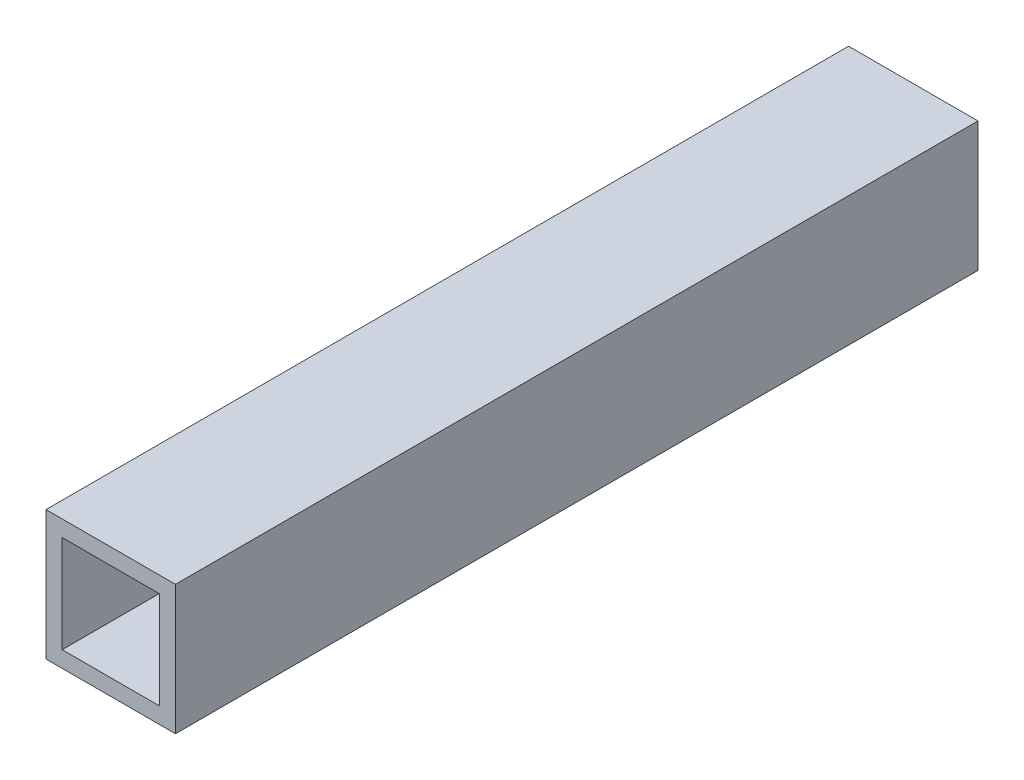
ISO-10303-21;
HEADER;
FILE_DESCRIPTION(('STEP AP214'),'2;1');
FILE_NAME('part.step','',(''),(''),'','','');
FILE_SCHEMA(('AUTOMOTIVE_DESIGN { 1 0 10303 214 1 1 1 1 }'));
ENDSEC;
DATA;
#1=APPLICATION_CONTEXT('core data for automotive mechanical design processes');
#2=APPLICATION_PROTOCOL_DEFINITION('international standard','automotive_design',2000,#1);
#3=PRODUCT_CONTEXT('',#1,'mechanical');
#4=PRODUCT('Part','Part','',(#3));
#5=PRODUCT_RELATED_PRODUCT_CATEGORY('part','',(#4));
#6=PRODUCT_DEFINITION_FORMATION('','',#4);
#7=PRODUCT_DEFINITION_CONTEXT('part definition',#1,'design');
#8=PRODUCT_DEFINITION('design','',#6,#7);
#9=PRODUCT_DEFINITION_SHAPE('','',#8);
#10=(LENGTH_UNIT() NAMED_UNIT(*) SI_UNIT(.MILLI.,.METRE.));
#11=(NAMED_UNIT(*) PLANE_ANGLE_UNIT() SI_UNIT($,.RADIAN.));
#12=(NAMED_UNIT(*) SI_UNIT($,.STERADIAN.) SOLID_ANGLE_UNIT());
#13=UNCERTAINTY_MEASURE_WITH_UNIT(LENGTH_MEASURE(1.E-05),#10,'distance_accuracy_value','');
#14=(GEOMETRIC_REPRESENTATION_CONTEXT(3) GLOBAL_UNCERTAINTY_ASSIGNED_CONTEXT((#13)) GLOBAL_UNIT_ASSIGNED_CONTEXT((#10,
#11,#12)) REPRESENTATION_CONTEXT('',''));
#15=CARTESIAN_POINT('',(0.,0.,0.));
#16=DIRECTION('',(0.,0.,1.));
#17=DIRECTION('',(1.,0.,0.));
#18=AXIS2_PLACEMENT_3D('',#15,#16,#17);
#19=CARTESIAN_POINT('',(0.,0.,78.74));
#20=DIRECTION('',(0.,0.,1.));
#21=DIRECTION('',(1.,0.,0.));
#22=AXIS2_PLACEMENT_3D('',#19,#20,#21);
#23=PLANE('',#22);
#24=DIRECTION('',(0.,-1.,0.));
#25=VECTOR('',#24,1.);
#26=CARTESIAN_POINT('',(-12.7,-12.7,78.74));
#27=LINE('',#26,#25);
#28=CARTESIAN_POINT('',(-12.7,12.7,78.74));
#29=VERTEX_POINT('',#28);
#30=CARTESIAN_POINT('',(-12.7,-12.7,78.74));
#31=VERTEX_POINT('',#30);
#32=EDGE_CURVE('E117',#29,#31,#27,.T.);
#33=ORIENTED_EDGE('',*,*,#32,.T.);
#34=DIRECTION('',(1.,0.,0.));
#35=VECTOR('',#34,1.);
#36=CARTESIAN_POINT('',(12.7,-12.7,78.74));
#37=LINE('',#36,#35);
#38=CARTESIAN_POINT('',(12.7,-12.7,78.74));
#39=VERTEX_POINT('',#38);
#40=EDGE_CURVE('E176',#31,#39,#37,.T.);
#41=ORIENTED_EDGE('',*,*,#40,.T.);
#42=DIRECTION('',(0.,1.,0.));
#43=VECTOR('',#42,1.);
#44=CARTESIAN_POINT('',(12.7,-12.7,78.74));
#45=LINE('',#44,#43);
#46=CARTESIAN_POINT('',(12.7,12.7,78.74));
#47=VERTEX_POINT('',#46);
#48=EDGE_CURVE('E179',#39,#47,#45,.T.);
#49=ORIENTED_EDGE('',*,*,#48,.T.);
#50=DIRECTION('',(-1.,0.,0.));
#51=VECTOR('',#50,1.);
#52=CARTESIAN_POINT('',(12.7,12.7,78.74));
#53=LINE('',#52,#51);
#54=EDGE_CURVE('E63',#47,#29,#53,.T.);
#55=ORIENTED_EDGE('',*,*,#54,.T.);
#56=EDGE_LOOP('',(#33,#41,#49,#55));
#57=FACE_BOUND('',#56,.T.);
#58=DIRECTION('',(1.,0.,0.));
#59=VECTOR('',#58,1.);
#60=CARTESIAN_POINT('',(9.525,-9.525,78.74));
#61=LINE('',#60,#59);
#62=CARTESIAN_POINT('',(-9.52499999999999,-9.525,78.74));
#63=VERTEX_POINT('',#62);
#64=CARTESIAN_POINT('',(9.525,-9.525,78.74));
#65=VERTEX_POINT('',#64);
#66=EDGE_CURVE('E158',#63,#65,#61,.T.);
#67=ORIENTED_EDGE('',*,*,#66,.F.);
#68=DIRECTION('',(0.,-1.,0.));
#69=VECTOR('',#68,1.);
#70=CARTESIAN_POINT('',(-9.52499999999999,-9.525,78.74));
#71=LINE('',#70,#69);
#72=CARTESIAN_POINT('',(-9.52499999999999,9.525,78.74));
#73=VERTEX_POINT('',#72);
#74=EDGE_CURVE('E113',#73,#63,#71,.T.);
#75=ORIENTED_EDGE('',*,*,#74,.F.);
#76=DIRECTION('',(-1.,0.,0.));
#77=VECTOR('',#76,1.);
#78=CARTESIAN_POINT('',(9.525,9.525,78.74));
#79=LINE('',#78,#77);
#80=CARTESIAN_POINT('',(9.525,9.525,78.74));
#81=VERTEX_POINT('',#80);
#82=EDGE_CURVE('E164',#81,#73,#79,.T.);
#83=ORIENTED_EDGE('',*,*,#82,.F.);
#84=DIRECTION('',(0.,1.,0.));
#85=VECTOR('',#84,1.);
#86=CARTESIAN_POINT('',(9.525,-9.525,78.74));
#87=LINE('',#86,#85);
#88=EDGE_CURVE('E161',#65,#81,#87,.T.);
#89=ORIENTED_EDGE('',*,*,#88,.F.);
#90=EDGE_LOOP('',(#67,#75,#83,#89));
#91=FACE_BOUND('',#90,.T.);
#92=ADVANCED_FACE('F39',(#57,#91),#23,.T.);
#93=CARTESIAN_POINT('',(-12.7,-12.7,78.74));
#94=DIRECTION('',(1.,0.,0.));
#95=DIRECTION('',(0.,0.,-1.));
#96=AXIS2_PLACEMENT_3D('',#93,#94,#95);
#97=PLANE('',#96);
#98=DIRECTION('',(0.,0.,-1.));
#99=VECTOR('',#98,1.);
#100=CARTESIAN_POINT('',(-12.7,12.7,78.74));
#101=LINE('',#100,#99);
#102=CARTESIAN_POINT('',(-12.7,12.7,-78.74));
#103=VERTEX_POINT('',#102);
#104=EDGE_CURVE('E184',#29,#103,#101,.T.);
#105=ORIENTED_EDGE('',*,*,#104,.T.);
#106=DIRECTION('',(0.,-1.,0.));
#107=VECTOR('',#106,1.);
#108=CARTESIAN_POINT('',(-12.7,-12.7,-78.74));
#109=LINE('',#108,#107);
#110=CARTESIAN_POINT('',(-12.7,-12.7,-78.74));
#111=VERTEX_POINT('',#110);
#112=EDGE_CURVE('E140',#103,#111,#109,.T.);
#113=ORIENTED_EDGE('',*,*,#112,.T.);
#114=DIRECTION('',(0.,0.,-1.));
#115=VECTOR('',#114,1.);
#116=CARTESIAN_POINT('',(-12.7,-12.7,78.74));
#117=LINE('',#116,#115);
#118=EDGE_CURVE('E11',#31,#111,#117,.T.);
#119=ORIENTED_EDGE('',*,*,#118,.F.);
#120=ORIENTED_EDGE('',*,*,#32,.F.);
#121=EDGE_LOOP('',(#105,#113,#119,#120));
#122=FACE_BOUND('',#121,.T.);
#123=ADVANCED_FACE('F41',(#122),#97,.F.);
#124=CARTESIAN_POINT('',(12.7,-12.7,78.74));
#125=DIRECTION('',(0.,1.,0.));
#126=DIRECTION('',(0.,0.,1.));
#127=AXIS2_PLACEMENT_3D('',#124,#125,#126);
#128=PLANE('',#127);
#129=ORIENTED_EDGE('',*,*,#118,.T.);
#130=DIRECTION('',(1.,0.,0.));
#131=VECTOR('',#130,1.);
#132=CARTESIAN_POINT('',(12.7,-12.7,-78.74));
#133=LINE('',#132,#131);
#134=CARTESIAN_POINT('',(12.7,-12.7,-78.74));
#135=VERTEX_POINT('',#134);
#136=EDGE_CURVE('E144',#111,#135,#133,.T.);
#137=ORIENTED_EDGE('',*,*,#136,.T.);
#138=DIRECTION('',(0.,0.,-1.));
#139=VECTOR('',#138,1.);
#140=CARTESIAN_POINT('',(12.7,-12.7,78.74));
#141=LINE('',#140,#139);
#142=EDGE_CURVE('E48',#39,#135,#141,.T.);
#143=ORIENTED_EDGE('',*,*,#142,.F.);
#144=ORIENTED_EDGE('',*,*,#40,.F.);
#145=EDGE_LOOP('',(#129,#137,#143,#144));
#146=FACE_BOUND('',#145,.T.);
#147=ADVANCED_FACE('F200',(#146),#128,.F.);
#148=CARTESIAN_POINT('',(12.7,-12.7,78.74));
#149=DIRECTION('',(-1.,0.,0.));
#150=DIRECTION('',(0.,0.,1.));
#151=AXIS2_PLACEMENT_3D('',#148,#149,#150);
#152=PLANE('',#151);
#153=ORIENTED_EDGE('',*,*,#142,.T.);
#154=DIRECTION('',(0.,1.,0.));
#155=VECTOR('',#154,1.);
#156=CARTESIAN_POINT('',(12.7,-12.7,-78.74));
#157=LINE('',#156,#155);
#158=CARTESIAN_POINT('',(12.7,12.7,-78.74));
#159=VERTEX_POINT('',#158);
#160=EDGE_CURVE('E148',#135,#159,#157,.T.);
#161=ORIENTED_EDGE('',*,*,#160,.T.);
#162=DIRECTION('',(0.,0.,-1.));
#163=VECTOR('',#162,1.);
#164=CARTESIAN_POINT('',(12.7,12.7,78.74));
#165=LINE('',#164,#163);
#166=EDGE_CURVE('E187',#47,#159,#165,.T.);
#167=ORIENTED_EDGE('',*,*,#166,.F.);
#168=ORIENTED_EDGE('',*,*,#48,.F.);
#169=EDGE_LOOP('',(#153,#161,#167,#168));
#170=FACE_BOUND('',#169,.T.);
#171=ADVANCED_FACE('F194',(#170),#152,.F.);
#172=CARTESIAN_POINT('',(12.7,12.7,78.74));
#173=DIRECTION('',(0.,-1.,0.));
#174=DIRECTION('',(0.,0.,-1.));
#175=AXIS2_PLACEMENT_3D('',#172,#173,#174);
#176=PLANE('',#175);
#177=ORIENTED_EDGE('',*,*,#166,.T.);
#178=DIRECTION('',(-1.,0.,0.));
#179=VECTOR('',#178,1.);
#180=CARTESIAN_POINT('',(12.7,12.7,-78.74));
#181=LINE('',#180,#179);
#182=EDGE_CURVE('E152',#159,#103,#181,.T.);
#183=ORIENTED_EDGE('',*,*,#182,.T.);
#184=ORIENTED_EDGE('',*,*,#104,.F.);
#185=ORIENTED_EDGE('',*,*,#54,.F.);
#186=EDGE_LOOP('',(#177,#183,#184,#185));
#187=FACE_BOUND('',#186,.T.);
#188=ADVANCED_FACE('F205',(#187),#176,.F.);
#189=CARTESIAN_POINT('',(-9.52499999999999,-9.525,78.74));
#190=DIRECTION('',(1.,0.,0.));
#191=DIRECTION('',(0.,0.,-1.));
#192=AXIS2_PLACEMENT_3D('',#189,#190,#191);
#193=PLANE('',#192);
#194=DIRECTION('',(0.,0.,-1.));
#195=VECTOR('',#194,1.);
#196=CARTESIAN_POINT('',(-9.52499999999999,-9.525,78.74));
#197=LINE('',#196,#195);
#198=CARTESIAN_POINT('',(-9.52499999999999,-9.525,-78.74));
#199=VERTEX_POINT('',#198);
#200=EDGE_CURVE('E105',#63,#199,#197,.T.);
#201=ORIENTED_EDGE('',*,*,#200,.T.);
#202=DIRECTION('',(0.,-1.,0.));
#203=VECTOR('',#202,1.);
#204=CARTESIAN_POINT('',(-9.52499999999999,-9.525,-78.74));
#205=LINE('',#204,#203);
#206=CARTESIAN_POINT('',(-9.52499999999999,9.525,-78.74));
#207=VERTEX_POINT('',#206);
#208=EDGE_CURVE('E110',#207,#199,#205,.T.);
#209=ORIENTED_EDGE('',*,*,#208,.F.);
#210=DIRECTION('',(0.,0.,-1.));
#211=VECTOR('',#210,1.);
#212=CARTESIAN_POINT('',(-9.52499999999999,9.525,78.74));
#213=LINE('',#212,#211);
#214=EDGE_CURVE('E167',#73,#207,#213,.T.);
#215=ORIENTED_EDGE('',*,*,#214,.F.);
#216=ORIENTED_EDGE('',*,*,#74,.T.);
#217=EDGE_LOOP('',(#201,#209,#215,#216));
#218=FACE_BOUND('',#217,.T.);
#219=ADVANCED_FACE('F107',(#218),#193,.T.);
#220=CARTESIAN_POINT('',(9.525,-9.525,78.74));
#221=DIRECTION('',(0.,1.,0.));
#222=DIRECTION('',(0.,0.,1.));
#223=AXIS2_PLACEMENT_3D('',#220,#221,#222);
#224=PLANE('',#223);
#225=DIRECTION('',(0.,0.,-1.));
#226=VECTOR('',#225,1.);
#227=CARTESIAN_POINT('',(9.525,-9.525,78.74));
#228=LINE('',#227,#226);
#229=CARTESIAN_POINT('',(9.525,-9.525,-78.74));
#230=VERTEX_POINT('',#229);
#231=EDGE_CURVE('E118',#65,#230,#228,.T.);
#232=ORIENTED_EDGE('',*,*,#231,.T.);
#233=DIRECTION('',(1.,0.,0.));
#234=VECTOR('',#233,1.);
#235=CARTESIAN_POINT('',(9.525,-9.525,-78.74));
#236=LINE('',#235,#234);
#237=EDGE_CURVE('E121',#199,#230,#236,.T.);
#238=ORIENTED_EDGE('',*,*,#237,.F.);
#239=ORIENTED_EDGE('',*,*,#200,.F.);
#240=ORIENTED_EDGE('',*,*,#66,.T.);
#241=EDGE_LOOP('',(#232,#238,#239,#240));
#242=FACE_BOUND('',#241,.T.);
#243=ADVANCED_FACE('F122',(#242),#224,.T.);
#244=CARTESIAN_POINT('',(9.525,-9.525,78.74));
#245=DIRECTION('',(-1.,0.,0.));
#246=DIRECTION('',(0.,0.,1.));
#247=AXIS2_PLACEMENT_3D('',#244,#245,#246);
#248=PLANE('',#247);
#249=DIRECTION('',(0.,0.,-1.));
#250=VECTOR('',#249,1.);
#251=CARTESIAN_POINT('',(9.525,9.525,78.74));
#252=LINE('',#251,#250);
#253=CARTESIAN_POINT('',(9.525,9.525,-78.74));
#254=VERTEX_POINT('',#253);
#255=EDGE_CURVE('E55',#81,#254,#252,.T.);
#256=ORIENTED_EDGE('',*,*,#255,.T.);
#257=DIRECTION('',(0.,1.,0.));
#258=VECTOR('',#257,1.);
#259=CARTESIAN_POINT('',(9.525,-9.525,-78.74));
#260=LINE('',#259,#258);
#261=EDGE_CURVE('E128',#230,#254,#260,.T.);
#262=ORIENTED_EDGE('',*,*,#261,.F.);
#263=ORIENTED_EDGE('',*,*,#231,.F.);
#264=ORIENTED_EDGE('',*,*,#88,.T.);
#265=EDGE_LOOP('',(#256,#262,#263,#264));
#266=FACE_BOUND('',#265,.T.);
#267=ADVANCED_FACE('F223',(#266),#248,.T.);
#268=CARTESIAN_POINT('',(9.525,9.525,78.74));
#269=DIRECTION('',(0.,-1.,0.));
#270=DIRECTION('',(0.,0.,-1.));
#271=AXIS2_PLACEMENT_3D('',#268,#269,#270);
#272=PLANE('',#271);
#273=ORIENTED_EDGE('',*,*,#214,.T.);
#274=DIRECTION('',(-1.,0.,0.));
#275=VECTOR('',#274,1.);
#276=CARTESIAN_POINT('',(9.525,9.525,-78.74));
#277=LINE('',#276,#275);
#278=EDGE_CURVE('E132',#254,#207,#277,.T.);
#279=ORIENTED_EDGE('',*,*,#278,.F.);
#280=ORIENTED_EDGE('',*,*,#255,.F.);
#281=ORIENTED_EDGE('',*,*,#82,.T.);
#282=EDGE_LOOP('',(#273,#279,#280,#281));
#283=FACE_BOUND('',#282,.T.);
#284=ADVANCED_FACE('F226',(#283),#272,.T.);
#285=CARTESIAN_POINT('',(0.,0.,-78.74));
#286=DIRECTION('',(0.,0.,1.));
#287=DIRECTION('',(1.,0.,0.));
#288=AXIS2_PLACEMENT_3D('',#285,#286,#287);
#289=PLANE('',#288);
#290=ORIENTED_EDGE('',*,*,#278,.T.);
#291=ORIENTED_EDGE('',*,*,#208,.T.);
#292=ORIENTED_EDGE('',*,*,#237,.T.);
#293=ORIENTED_EDGE('',*,*,#261,.T.);
#294=EDGE_LOOP('',(#290,#291,#292,#293));
#295=FACE_BOUND('',#294,.T.);
#296=ORIENTED_EDGE('',*,*,#112,.F.);
#297=ORIENTED_EDGE('',*,*,#182,.F.);
#298=ORIENTED_EDGE('',*,*,#160,.F.);
#299=ORIENTED_EDGE('',*,*,#136,.F.);
#300=EDGE_LOOP('',(#296,#297,#298,#299));
#301=FACE_BOUND('',#300,.T.);
#302=ADVANCED_FACE('F130',(#295,#301),#289,.F.);
#303=CLOSED_SHELL('',(#92,#123,#147,#171,#188,#219,#243,#267,#284,#302));
#304=MANIFOLD_SOLID_BREP('B2',#303);
#305=ADVANCED_BREP_SHAPE_REPRESENTATION('',(#18,#304),#14);
#306=SHAPE_DEFINITION_REPRESENTATION(#9,#305);
ENDSEC;
END-ISO-10303-21;
